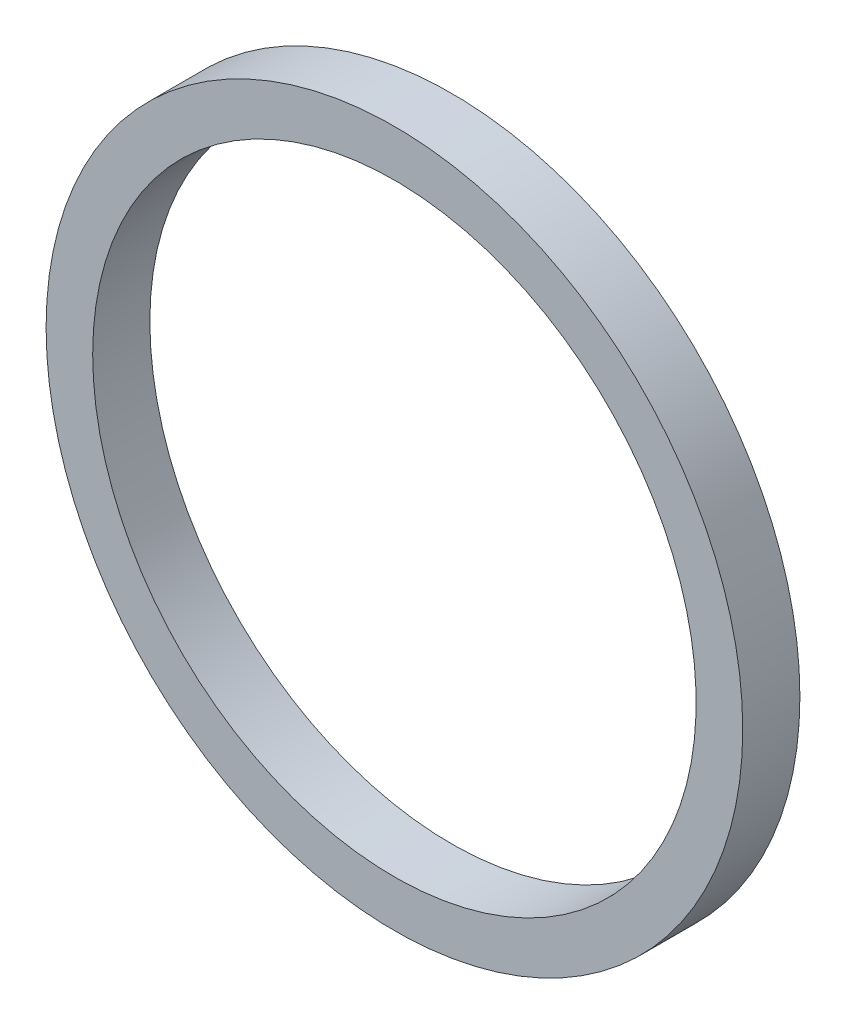
ISO-10303-21;
HEADER;
FILE_DESCRIPTION(('STEP AP214'),'2;1');
FILE_NAME('part.step','',(''),(''),'','','');
FILE_SCHEMA(('AUTOMOTIVE_DESIGN { 1 0 10303 214 1 1 1 1 }'));
ENDSEC;
DATA;
#1=APPLICATION_CONTEXT('core data for automotive mechanical design processes');
#2=APPLICATION_PROTOCOL_DEFINITION('international standard','automotive_design',2000,#1);
#3=PRODUCT_CONTEXT('',#1,'mechanical');
#4=PRODUCT('Part','Part','',(#3));
#5=PRODUCT_RELATED_PRODUCT_CATEGORY('part','',(#4));
#6=PRODUCT_DEFINITION_FORMATION('','',#4);
#7=PRODUCT_DEFINITION_CONTEXT('part definition',#1,'design');
#8=PRODUCT_DEFINITION('design','',#6,#7);
#9=PRODUCT_DEFINITION_SHAPE('','',#8);
#10=(LENGTH_UNIT() NAMED_UNIT(*) SI_UNIT(.MILLI.,.METRE.));
#11=(NAMED_UNIT(*) PLANE_ANGLE_UNIT() SI_UNIT($,.RADIAN.));
#12=(NAMED_UNIT(*) SI_UNIT($,.STERADIAN.) SOLID_ANGLE_UNIT());
#13=UNCERTAINTY_MEASURE_WITH_UNIT(LENGTH_MEASURE(1.E-05),#10,'distance_accuracy_value','');
#14=(GEOMETRIC_REPRESENTATION_CONTEXT(3) GLOBAL_UNCERTAINTY_ASSIGNED_CONTEXT((#13)) GLOBAL_UNIT_ASSIGNED_CONTEXT((#10,
#11,#12)) REPRESENTATION_CONTEXT('',''));
#15=CARTESIAN_POINT('',(0.,0.,0.));
#16=DIRECTION('',(0.,0.,1.));
#17=DIRECTION('',(1.,0.,0.));
#18=AXIS2_PLACEMENT_3D('',#15,#16,#17);
#19=CARTESIAN_POINT('',(0.,0.,2.7));
#20=DIRECTION('',(0.,0.,1.));
#21=DIRECTION('',(1.,0.,0.));
#22=AXIS2_PLACEMENT_3D('',#19,#20,#21);
#23=PLANE('',#22);
#24=CARTESIAN_POINT('',(0.,0.,2.7));
#25=DIRECTION('',(0.,0.,1.));
#26=DIRECTION('',(1.,0.,0.));
#27=AXIS2_PLACEMENT_3D('',#24,#25,#26);
#28=CIRCLE('',#27,16.45);
#29=CARTESIAN_POINT('',(-16.45,0.,2.7));
#30=VERTEX_POINT('',#29);
#31=EDGE_CURVE('E12',#30,#30,#28,.T.);
#32=ORIENTED_EDGE('',*,*,#31,.T.);
#33=EDGE_LOOP('',(#32));
#34=FACE_BOUND('',#33,.T.);
#35=CARTESIAN_POINT('',(0.,0.,2.7));
#36=DIRECTION('',(0.,0.,1.));
#37=DIRECTION('',(1.,0.,0.));
#38=AXIS2_PLACEMENT_3D('',#35,#36,#37);
#39=CIRCLE('',#38,14.25);
#40=CARTESIAN_POINT('',(-14.25,0.,2.7));
#41=VERTEX_POINT('',#40);
#42=EDGE_CURVE('E52',#41,#41,#39,.T.);
#43=ORIENTED_EDGE('',*,*,#42,.F.);
#44=EDGE_LOOP('',(#43));
#45=FACE_BOUND('',#44,.T.);
#46=ADVANCED_FACE('F41',(#34,#45),#23,.T.);
#47=CARTESIAN_POINT('',(0.,0.,0.));
#48=DIRECTION('',(0.,0.,1.));
#49=DIRECTION('',(1.,0.,0.));
#50=AXIS2_PLACEMENT_3D('',#47,#48,#49);
#51=PLANE('',#50);
#52=CARTESIAN_POINT('',(0.,0.,0.));
#53=DIRECTION('',(0.,0.,1.));
#54=DIRECTION('',(1.,0.,0.));
#55=AXIS2_PLACEMENT_3D('',#52,#53,#54);
#56=CIRCLE('',#55,16.45);
#57=CARTESIAN_POINT('',(-16.45,0.,0.));
#58=VERTEX_POINT('',#57);
#59=EDGE_CURVE('E45',#58,#58,#56,.T.);
#60=ORIENTED_EDGE('',*,*,#59,.F.);
#61=EDGE_LOOP('',(#60));
#62=FACE_BOUND('',#61,.T.);
#63=CARTESIAN_POINT('',(0.,0.,0.));
#64=DIRECTION('',(0.,0.,1.));
#65=DIRECTION('',(1.,0.,0.));
#66=AXIS2_PLACEMENT_3D('',#63,#64,#65);
#67=CIRCLE('',#66,14.25);
#68=CARTESIAN_POINT('',(-14.25,0.,0.));
#69=VERTEX_POINT('',#68);
#70=EDGE_CURVE('E54',#69,#69,#67,.T.);
#71=ORIENTED_EDGE('',*,*,#70,.T.);
#72=EDGE_LOOP('',(#71));
#73=FACE_BOUND('',#72,.T.);
#74=ADVANCED_FACE('F64',(#62,#73),#51,.F.);
#75=CARTESIAN_POINT('',(0.,0.,2.7));
#76=DIRECTION('',(0.,0.,-1.));
#77=DIRECTION('',(-1.,0.,0.));
#78=AXIS2_PLACEMENT_3D('',#75,#76,#77);
#79=CYLINDRICAL_SURFACE('',#78,16.45);
#80=CARTESIAN_POINT('',(-16.45,0.,2.7));
#81=CARTESIAN_POINT('',(-16.45,0.,2.671875));
#82=CARTESIAN_POINT('',(-16.45,0.,2.64375));
#83=CARTESIAN_POINT('',(-16.45,0.,2.5875));
#84=CARTESIAN_POINT('',(-16.45,0.,2.559375));
#85=CARTESIAN_POINT('',(-16.45,0.,2.503125));
#86=CARTESIAN_POINT('',(-16.45,0.,2.475));
#87=CARTESIAN_POINT('',(-16.45,0.,2.41875));
#88=CARTESIAN_POINT('',(-16.45,0.,2.390625));
#89=CARTESIAN_POINT('',(-16.45,0.,2.334375));
#90=CARTESIAN_POINT('',(-16.45,0.,2.30625));
#91=CARTESIAN_POINT('',(-16.45,0.,2.25));
#92=CARTESIAN_POINT('',(-16.45,0.,2.221875));
#93=CARTESIAN_POINT('',(-16.45,0.,2.165625));
#94=CARTESIAN_POINT('',(-16.45,0.,2.1375));
#95=CARTESIAN_POINT('',(-16.45,0.,2.08125));
#96=CARTESIAN_POINT('',(-16.45,0.,2.053125));
#97=CARTESIAN_POINT('',(-16.45,0.,1.996875));
#98=CARTESIAN_POINT('',(-16.45,0.,1.96875));
#99=CARTESIAN_POINT('',(-16.45,0.,1.9125));
#100=CARTESIAN_POINT('',(-16.45,0.,1.884375));
#101=CARTESIAN_POINT('',(-16.45,0.,1.828125));
#102=CARTESIAN_POINT('',(-16.45,0.,1.8));
#103=CARTESIAN_POINT('',(-16.45,0.,1.74375));
#104=CARTESIAN_POINT('',(-16.45,0.,1.715625));
#105=CARTESIAN_POINT('',(-16.45,0.,1.659375));
#106=CARTESIAN_POINT('',(-16.45,0.,1.63125));
#107=CARTESIAN_POINT('',(-16.45,0.,1.575));
#108=CARTESIAN_POINT('',(-16.45,0.,1.546875));
#109=CARTESIAN_POINT('',(-16.45,0.,1.490625));
#110=CARTESIAN_POINT('',(-16.45,0.,1.4625));
#111=CARTESIAN_POINT('',(-16.45,0.,1.40625));
#112=CARTESIAN_POINT('',(-16.45,0.,1.378125));
#113=CARTESIAN_POINT('',(-16.45,0.,1.321875));
#114=CARTESIAN_POINT('',(-16.45,0.,1.29375));
#115=CARTESIAN_POINT('',(-16.45,0.,1.2375));
#116=CARTESIAN_POINT('',(-16.45,0.,1.209375));
#117=CARTESIAN_POINT('',(-16.45,0.,1.153125));
#118=CARTESIAN_POINT('',(-16.45,0.,1.125));
#119=CARTESIAN_POINT('',(-16.45,0.,1.06875));
#120=CARTESIAN_POINT('',(-16.45,0.,1.040625));
#121=CARTESIAN_POINT('',(-16.45,0.,0.984375));
#122=CARTESIAN_POINT('',(-16.45,0.,0.95625));
#123=CARTESIAN_POINT('',(-16.45,0.,0.9));
#124=CARTESIAN_POINT('',(-16.45,0.,0.871875));
#125=CARTESIAN_POINT('',(-16.45,0.,0.815625));
#126=CARTESIAN_POINT('',(-16.45,0.,0.7875));
#127=CARTESIAN_POINT('',(-16.45,0.,0.73125));
#128=CARTESIAN_POINT('',(-16.45,0.,0.703125));
#129=CARTESIAN_POINT('',(-16.45,0.,0.646875));
#130=CARTESIAN_POINT('',(-16.45,0.,0.61875));
#131=CARTESIAN_POINT('',(-16.45,0.,0.5625));
#132=CARTESIAN_POINT('',(-16.45,0.,0.534375));
#133=CARTESIAN_POINT('',(-16.45,0.,0.478125));
#134=CARTESIAN_POINT('',(-16.45,0.,0.45));
#135=CARTESIAN_POINT('',(-16.45,0.,0.39375));
#136=CARTESIAN_POINT('',(-16.45,0.,0.365625));
#137=CARTESIAN_POINT('',(-16.45,0.,0.309375));
#138=CARTESIAN_POINT('',(-16.45,0.,0.28125));
#139=CARTESIAN_POINT('',(-16.45,0.,0.225));
#140=CARTESIAN_POINT('',(-16.45,0.,0.196875));
#141=CARTESIAN_POINT('',(-16.45,0.,0.140625));
#142=CARTESIAN_POINT('',(-16.45,0.,0.112499999999999));
#143=CARTESIAN_POINT('',(-16.45,0.,0.0562499999999994));
#144=CARTESIAN_POINT('',(-16.45,0.,0.0281249999999995));
#145=CARTESIAN_POINT('',(-16.45,0.,0.));
#146=B_SPLINE_CURVE_WITH_KNOTS('',3,(#80,#81,#82,#83,#84,#85,#86,#87,#88,#89,#90,#91,#92,#93,
#94,#95,#96,#97,#98,#99,#100,#101,#102,#103,#104,#105,#106,#107,#108,#109,#110,#111,#112,#113,
#114,#115,#116,#117,#118,#119,#120,#121,#122,#123,#124,#125,#126,#127,#128,#129,#130,#131,#132,
#133,#134,#135,#136,#137,#138,#139,#140,#141,#142,#143,#144,#145),.UNSPECIFIED.,.F.,.F.,(4,2,2,
2,2,2,2,2,2,2,2,2,2,2,2,2,2,2,2,2,2,2,2,2,2,2,2,2,2,2,2,2,4),(0.,0.0843749999999998,0.16875,
0.253125,0.3375,0.421875,0.50625,0.590625,0.675,0.759375,0.84375,0.928125,1.0125,1.096875,
1.18125,1.265625,1.35,1.434375,1.51875,1.603125,1.6875,1.771875,1.85625,1.940625,2.025,2.109375,
2.19375,2.278125,2.3625,2.446875,2.53125,2.615625,2.7),.UNSPECIFIED.);
#147=EDGE_CURVE('BSEAM43',#30,#58,#146,.T.);
#148=ORIENTED_EDGE('',*,*,#31,.F.);
#149=ORIENTED_EDGE('',*,*,#59,.T.);
#150=ORIENTED_EDGE('',*,*,#147,.T.);
#151=ORIENTED_EDGE('',*,*,#147,.F.);
#152=EDGE_LOOP('',(#148,#150,#149,#151));
#153=FACE_BOUND('',#152,.T.);
#154=ADVANCED_FACE('F43',(#153),#79,.T.);
#155=CARTESIAN_POINT('',(0.,0.,2.7));
#156=DIRECTION('',(0.,0.,-1.));
#157=DIRECTION('',(-1.,0.,0.));
#158=AXIS2_PLACEMENT_3D('',#155,#156,#157);
#159=CYLINDRICAL_SURFACE('',#158,14.25);
#160=CARTESIAN_POINT('',(-14.25,0.,2.7));
#161=CARTESIAN_POINT('',(-14.25,0.,2.671875));
#162=CARTESIAN_POINT('',(-14.25,0.,2.64375));
#163=CARTESIAN_POINT('',(-14.25,0.,2.5875));
#164=CARTESIAN_POINT('',(-14.25,0.,2.559375));
#165=CARTESIAN_POINT('',(-14.25,0.,2.503125));
#166=CARTESIAN_POINT('',(-14.25,0.,2.475));
#167=CARTESIAN_POINT('',(-14.25,0.,2.41875));
#168=CARTESIAN_POINT('',(-14.25,0.,2.390625));
#169=CARTESIAN_POINT('',(-14.25,0.,2.334375));
#170=CARTESIAN_POINT('',(-14.25,0.,2.30625));
#171=CARTESIAN_POINT('',(-14.25,0.,2.25));
#172=CARTESIAN_POINT('',(-14.25,0.,2.221875));
#173=CARTESIAN_POINT('',(-14.25,0.,2.165625));
#174=CARTESIAN_POINT('',(-14.25,0.,2.1375));
#175=CARTESIAN_POINT('',(-14.25,0.,2.08125));
#176=CARTESIAN_POINT('',(-14.25,0.,2.053125));
#177=CARTESIAN_POINT('',(-14.25,0.,1.996875));
#178=CARTESIAN_POINT('',(-14.25,0.,1.96875));
#179=CARTESIAN_POINT('',(-14.25,0.,1.9125));
#180=CARTESIAN_POINT('',(-14.25,0.,1.884375));
#181=CARTESIAN_POINT('',(-14.25,0.,1.828125));
#182=CARTESIAN_POINT('',(-14.25,0.,1.8));
#183=CARTESIAN_POINT('',(-14.25,0.,1.74375));
#184=CARTESIAN_POINT('',(-14.25,0.,1.715625));
#185=CARTESIAN_POINT('',(-14.25,0.,1.659375));
#186=CARTESIAN_POINT('',(-14.25,0.,1.63125));
#187=CARTESIAN_POINT('',(-14.25,0.,1.575));
#188=CARTESIAN_POINT('',(-14.25,0.,1.546875));
#189=CARTESIAN_POINT('',(-14.25,0.,1.490625));
#190=CARTESIAN_POINT('',(-14.25,0.,1.4625));
#191=CARTESIAN_POINT('',(-14.25,0.,1.40625));
#192=CARTESIAN_POINT('',(-14.25,0.,1.378125));
#193=CARTESIAN_POINT('',(-14.25,0.,1.321875));
#194=CARTESIAN_POINT('',(-14.25,0.,1.29375));
#195=CARTESIAN_POINT('',(-14.25,0.,1.2375));
#196=CARTESIAN_POINT('',(-14.25,0.,1.209375));
#197=CARTESIAN_POINT('',(-14.25,0.,1.153125));
#198=CARTESIAN_POINT('',(-14.25,0.,1.125));
#199=CARTESIAN_POINT('',(-14.25,0.,1.06875));
#200=CARTESIAN_POINT('',(-14.25,0.,1.040625));
#201=CARTESIAN_POINT('',(-14.25,0.,0.984375));
#202=CARTESIAN_POINT('',(-14.25,0.,0.956249999999999));
#203=CARTESIAN_POINT('',(-14.25,0.,0.899999999999999));
#204=CARTESIAN_POINT('',(-14.25,0.,0.871875));
#205=CARTESIAN_POINT('',(-14.25,0.,0.815624999999999));
#206=CARTESIAN_POINT('',(-14.25,0.,0.787499999999999));
#207=CARTESIAN_POINT('',(-14.25,0.,0.73125));
#208=CARTESIAN_POINT('',(-14.25,0.,0.703125));
#209=CARTESIAN_POINT('',(-14.25,0.,0.646875));
#210=CARTESIAN_POINT('',(-14.25,0.,0.61875));
#211=CARTESIAN_POINT('',(-14.25,0.,0.5625));
#212=CARTESIAN_POINT('',(-14.25,0.,0.534375));
#213=CARTESIAN_POINT('',(-14.25,0.,0.478125));
#214=CARTESIAN_POINT('',(-14.25,0.,0.45));
#215=CARTESIAN_POINT('',(-14.25,0.,0.39375));
#216=CARTESIAN_POINT('',(-14.25,0.,0.365625));
#217=CARTESIAN_POINT('',(-14.25,0.,0.309375));
#218=CARTESIAN_POINT('',(-14.25,0.,0.28125));
#219=CARTESIAN_POINT('',(-14.25,0.,0.225));
#220=CARTESIAN_POINT('',(-14.25,0.,0.196875));
#221=CARTESIAN_POINT('',(-14.25,0.,0.140625));
#222=CARTESIAN_POINT('',(-14.25,0.,0.1125));
#223=CARTESIAN_POINT('',(-14.25,0.,0.0562499999999997));
#224=CARTESIAN_POINT('',(-14.25,0.,0.0281249999999996));
#225=CARTESIAN_POINT('',(-14.25,0.,0.));
#226=B_SPLINE_CURVE_WITH_KNOTS('',3,(#160,#161,#162,#163,#164,#165,#166,#167,#168,#169,#170,
#171,#172,#173,#174,#175,#176,#177,#178,#179,#180,#181,#182,#183,#184,#185,#186,#187,#188,#189,
#190,#191,#192,#193,#194,#195,#196,#197,#198,#199,#200,#201,#202,#203,#204,#205,#206,#207,#208,
#209,#210,#211,#212,#213,#214,#215,#216,#217,#218,#219,#220,#221,#222,#223,#224,#225),
.UNSPECIFIED.,.F.,.F.,(4,2,2,2,2,2,2,2,2,2,2,2,2,2,2,2,2,2,2,2,2,2,2,2,2,2,2,2,2,2,2,2,4),(0.,
0.0843750000000003,0.16875,0.253125,0.3375,0.421875,0.50625,0.590625,0.675,0.759375,0.84375,
0.928125000000001,1.0125,1.096875,1.18125,1.265625,1.35,1.434375,1.51875,1.603125,1.6875,
1.771875,1.85625,1.940625,2.025,2.109375,2.19375,2.278125,2.3625,2.446875,2.53125,2.615625,2.7),.UNSPECIFIED.);
#227=EDGE_CURVE('BSEAM60',#41,#69,#226,.T.);
#228=ORIENTED_EDGE('',*,*,#42,.T.);
#229=ORIENTED_EDGE('',*,*,#70,.F.);
#230=ORIENTED_EDGE('',*,*,#227,.T.);
#231=ORIENTED_EDGE('',*,*,#227,.F.);
#232=EDGE_LOOP('',(#228,#230,#229,#231));
#233=FACE_BOUND('',#232,.T.);
#234=ADVANCED_FACE('F60',(#233),#159,.F.);
#235=CLOSED_SHELL('',(#46,#74,#154,#234));
#236=MANIFOLD_SOLID_BREP('B2',#235);
#237=ADVANCED_BREP_SHAPE_REPRESENTATION('',(#18,#236),#14);
#238=SHAPE_DEFINITION_REPRESENTATION(#9,#237);
ENDSEC;
END-ISO-10303-21;
